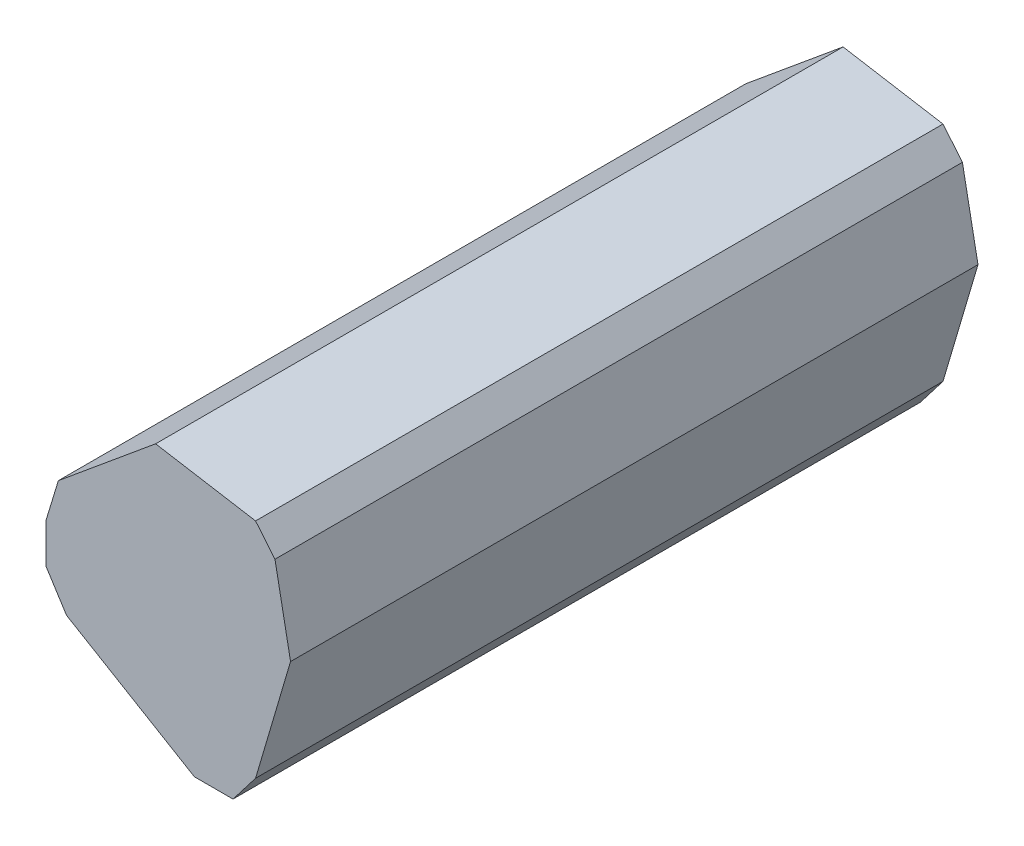
ISO-10303-21;
HEADER;
FILE_DESCRIPTION(('STEP AP214'),'2;1');
FILE_NAME('part.step','',(''),(''),'','','');
FILE_SCHEMA(('AUTOMOTIVE_DESIGN { 1 0 10303 214 1 1 1 1 }'));
ENDSEC;
DATA;
#1=APPLICATION_CONTEXT('core data for automotive mechanical design processes');
#2=APPLICATION_PROTOCOL_DEFINITION('international standard','automotive_design',2000,#1);
#3=PRODUCT_CONTEXT('',#1,'mechanical');
#4=PRODUCT('Part','Part','',(#3));
#5=PRODUCT_RELATED_PRODUCT_CATEGORY('part','',(#4));
#6=PRODUCT_DEFINITION_FORMATION('','',#4);
#7=PRODUCT_DEFINITION_CONTEXT('part definition',#1,'design');
#8=PRODUCT_DEFINITION('design','',#6,#7);
#9=PRODUCT_DEFINITION_SHAPE('','',#8);
#10=(LENGTH_UNIT() NAMED_UNIT(*) SI_UNIT(.MILLI.,.METRE.));
#11=(NAMED_UNIT(*) PLANE_ANGLE_UNIT() SI_UNIT($,.RADIAN.));
#12=(NAMED_UNIT(*) SI_UNIT($,.STERADIAN.) SOLID_ANGLE_UNIT());
#13=UNCERTAINTY_MEASURE_WITH_UNIT(LENGTH_MEASURE(1.E-05),#10,'distance_accuracy_value','');
#14=(GEOMETRIC_REPRESENTATION_CONTEXT(3) GLOBAL_UNCERTAINTY_ASSIGNED_CONTEXT((#13)) GLOBAL_UNIT_ASSIGNED_CONTEXT((#10,
#11,#12)) REPRESENTATION_CONTEXT('',''));
#15=CARTESIAN_POINT('',(0.,0.,0.));
#16=DIRECTION('',(0.,0.,1.));
#17=DIRECTION('',(1.,0.,0.));
#18=AXIS2_PLACEMENT_3D('',#15,#16,#17);
#19=CARTESIAN_POINT('',(-0.539610728637285,-8.59455076937365,30.));
#20=DIRECTION('',(0.956610637021111,-0.291369334587676,0.));
#21=DIRECTION('',(0.291369334587676,0.956610637021111,0.));
#22=AXIS2_PLACEMENT_3D('',#19,#20,#21);
#23=PLANE('',#22);
#24=DIRECTION('',(-0.291369334587676,-0.956610637021111,0.));
#25=VECTOR('',#24,1.);
#26=CARTESIAN_POINT('',(-0.539610728637285,-8.59455076937365,0.));
#27=LINE('',#26,#25);
#28=CARTESIAN_POINT('',(0.,-6.82292520144756,0.));
#29=VERTEX_POINT('',#28);
#30=CARTESIAN_POINT('',(-0.539610728637285,-8.59455076937365,0.));
#31=VERTEX_POINT('',#30);
#32=EDGE_CURVE('E149',#29,#31,#27,.T.);
#33=ORIENTED_EDGE('',*,*,#32,.T.);
#34=DIRECTION('',(0.,0.,-1.));
#35=VECTOR('',#34,1.);
#36=CARTESIAN_POINT('',(-0.539610728637285,-8.59455076937365,30.));
#37=LINE('',#36,#35);
#38=CARTESIAN_POINT('',(-0.539610728637285,-8.59455076937365,30.));
#39=VERTEX_POINT('',#38);
#40=EDGE_CURVE('E11',#39,#31,#37,.T.);
#41=ORIENTED_EDGE('',*,*,#40,.F.);
#42=DIRECTION('',(-0.291369334587676,-0.956610637021111,0.));
#43=VECTOR('',#42,1.);
#44=CARTESIAN_POINT('',(-0.539610728637285,-8.59455076937365,30.));
#45=LINE('',#44,#43);
#46=CARTESIAN_POINT('',(0.,-6.82292520144756,30.));
#47=VERTEX_POINT('',#46);
#48=EDGE_CURVE('E169',#47,#39,#45,.T.);
#49=ORIENTED_EDGE('',*,*,#48,.F.);
#50=DIRECTION('',(0.,0.,-1.));
#51=VECTOR('',#50,1.);
#52=CARTESIAN_POINT('',(0.,-6.82292520144756,30.));
#53=LINE('',#52,#51);
#54=EDGE_CURVE('E145',#47,#29,#53,.T.);
#55=ORIENTED_EDGE('',*,*,#54,.T.);
#56=EDGE_LOOP('',(#33,#41,#49,#55));
#57=FACE_BOUND('',#56,.T.);
#58=ADVANCED_FACE('F35',(#57),#23,.F.);
#59=CARTESIAN_POINT('',(-0.539610728637285,-10.3300637876913,30.));
#60=DIRECTION('',(1.,0.,0.));
#61=DIRECTION('',(0.,0.,-1.));
#62=AXIS2_PLACEMENT_3D('',#59,#60,#61);
#63=PLANE('',#62);
#64=DIRECTION('',(0.,-1.,0.));
#65=VECTOR('',#64,1.);
#66=CARTESIAN_POINT('',(-0.539610728637285,-10.3300637876913,0.));
#67=LINE('',#66,#65);
#68=CARTESIAN_POINT('',(-0.539610728637285,-10.3300637876913,0.));
#69=VERTEX_POINT('',#68);
#70=EDGE_CURVE('E152',#31,#69,#67,.T.);
#71=ORIENTED_EDGE('',*,*,#70,.T.);
#72=DIRECTION('',(0.,0.,-1.));
#73=VECTOR('',#72,1.);
#74=CARTESIAN_POINT('',(-0.539610728637285,-10.3300637876913,30.));
#75=LINE('',#74,#73);
#76=CARTESIAN_POINT('',(-0.539610728637285,-10.3300637876913,30.));
#77=VERTEX_POINT('',#76);
#78=EDGE_CURVE('E43',#77,#69,#75,.T.);
#79=ORIENTED_EDGE('',*,*,#78,.F.);
#80=DIRECTION('',(0.,-1.,0.));
#81=VECTOR('',#80,1.);
#82=CARTESIAN_POINT('',(-0.539610728637285,-10.3300637876913,30.));
#83=LINE('',#82,#81);
#84=EDGE_CURVE('E103',#39,#77,#83,.T.);
#85=ORIENTED_EDGE('',*,*,#84,.F.);
#86=ORIENTED_EDGE('',*,*,#40,.T.);
#87=EDGE_LOOP('',(#71,#79,#85,#86));
#88=FACE_BOUND('',#87,.T.);
#89=ADVANCED_FACE('F241',(#88),#63,.F.);
#90=CARTESIAN_POINT('',(0.35570281020208,-11.7351455443057,30.));
#91=DIRECTION('',(0.843343100026109,0.537375488497897,0.));
#92=DIRECTION('',(-0.537375488497897,0.843343100026109,0.));
#93=AXIS2_PLACEMENT_3D('',#90,#91,#92);
#94=PLANE('',#93);
#95=DIRECTION('',(0.537375488497897,-0.843343100026109,0.));
#96=VECTOR('',#95,1.);
#97=CARTESIAN_POINT('',(0.35570281020208,-11.7351455443057,0.));
#98=LINE('',#97,#96);
#99=CARTESIAN_POINT('',(0.35570281020208,-11.7351455443057,0.));
#100=VERTEX_POINT('',#99);
#101=EDGE_CURVE('E154',#69,#100,#98,.T.);
#102=ORIENTED_EDGE('',*,*,#101,.T.);
#103=DIRECTION('',(0.,0.,-1.));
#104=VECTOR('',#103,1.);
#105=CARTESIAN_POINT('',(0.35570281020208,-11.7351455443057,30.));
#106=LINE('',#105,#104);
#107=CARTESIAN_POINT('',(0.35570281020208,-11.7351455443057,30.));
#108=VERTEX_POINT('',#107);
#109=EDGE_CURVE('E185',#108,#100,#106,.T.);
#110=ORIENTED_EDGE('',*,*,#109,.F.);
#111=DIRECTION('',(0.537375488497897,-0.843343100026109,0.));
#112=VECTOR('',#111,1.);
#113=CARTESIAN_POINT('',(0.35570281020208,-11.7351455443057,30.));
#114=LINE('',#113,#112);
#115=EDGE_CURVE('E193',#77,#108,#114,.T.);
#116=ORIENTED_EDGE('',*,*,#115,.F.);
#117=ORIENTED_EDGE('',*,*,#78,.T.);
#118=EDGE_LOOP('',(#102,#110,#116,#117));
#119=FACE_BOUND('',#118,.T.);
#120=ADVANCED_FACE('F191',(#119),#94,.F.);
#121=CARTESIAN_POINT('',(5.93702203997669,-15.0473772654607,30.));
#122=DIRECTION('',(0.51034774842483,0.859968124803302,0.));
#123=DIRECTION('',(-0.859968124803302,0.51034774842483,0.));
#124=AXIS2_PLACEMENT_3D('',#121,#122,#123);
#125=PLANE('',#124);
#126=DIRECTION('',(0.859968124803301,-0.51034774842483,0.));
#127=VECTOR('',#126,1.);
#128=CARTESIAN_POINT('',(5.93702203997669,-15.0473772654607,0.));
#129=LINE('',#128,#127);
#130=CARTESIAN_POINT('',(5.93702203997669,-15.0473772654607,0.));
#131=VERTEX_POINT('',#130);
#132=EDGE_CURVE('E156',#100,#131,#129,.T.);
#133=ORIENTED_EDGE('',*,*,#132,.T.);
#134=DIRECTION('',(0.,0.,-1.));
#135=VECTOR('',#134,1.);
#136=CARTESIAN_POINT('',(5.93702203997669,-15.0473772654607,30.));
#137=LINE('',#136,#135);
#138=CARTESIAN_POINT('',(5.93702203997669,-15.0473772654607,30.));
#139=VERTEX_POINT('',#138);
#140=EDGE_CURVE('E182',#139,#131,#137,.T.);
#141=ORIENTED_EDGE('',*,*,#140,.F.);
#142=DIRECTION('',(0.859968124803301,-0.51034774842483,0.));
#143=VECTOR('',#142,1.);
#144=CARTESIAN_POINT('',(5.93702203997669,-15.0473772654607,30.));
#145=LINE('',#144,#143);
#146=EDGE_CURVE('E211',#108,#139,#145,.T.);
#147=ORIENTED_EDGE('',*,*,#146,.F.);
#148=ORIENTED_EDGE('',*,*,#109,.T.);
#149=EDGE_LOOP('',(#133,#141,#147,#148));
#150=FACE_BOUND('',#149,.T.);
#151=ADVANCED_FACE('F202',(#150),#125,.F.);
#152=CARTESIAN_POINT('',(7.62232399404184,-15.0473772654607,30.));
#153=DIRECTION('',(0.,1.,0.));
#154=DIRECTION('',(0.,0.,1.));
#155=AXIS2_PLACEMENT_3D('',#152,#153,#154);
#156=PLANE('',#155);
#157=DIRECTION('',(1.,0.,0.));
#158=VECTOR('',#157,1.);
#159=CARTESIAN_POINT('',(7.62232399404184,-15.0473772654607,0.));
#160=LINE('',#159,#158);
#161=CARTESIAN_POINT('',(7.62232399404184,-15.0473772654607,0.));
#162=VERTEX_POINT('',#161);
#163=EDGE_CURVE('E158',#131,#162,#160,.T.);
#164=ORIENTED_EDGE('',*,*,#163,.T.);
#165=DIRECTION('',(0.,0.,-1.));
#166=VECTOR('',#165,1.);
#167=CARTESIAN_POINT('',(7.62232399404184,-15.0473772654607,30.));
#168=LINE('',#167,#166);
#169=CARTESIAN_POINT('',(7.62232399404184,-15.0473772654607,30.));
#170=VERTEX_POINT('',#169);
#171=EDGE_CURVE('E179',#170,#162,#168,.T.);
#172=ORIENTED_EDGE('',*,*,#171,.F.);
#173=DIRECTION('',(1.,0.,0.));
#174=VECTOR('',#173,1.);
#175=CARTESIAN_POINT('',(7.62232399404184,-15.0473772654607,30.));
#176=LINE('',#175,#174);
#177=EDGE_CURVE('E208',#139,#170,#176,.T.);
#178=ORIENTED_EDGE('',*,*,#177,.F.);
#179=ORIENTED_EDGE('',*,*,#140,.T.);
#180=EDGE_LOOP('',(#164,#172,#178,#179));
#181=FACE_BOUND('',#180,.T.);
#182=ADVANCED_FACE('F206',(#181),#156,.F.);
#183=CARTESIAN_POINT('',(8.60567491807274,-13.7684778708262,30.));
#184=DIRECTION('',(-0.792749142789878,0.609548026496611,0.));
#185=DIRECTION('',(-0.609548026496611,-0.792749142789878,0.));
#186=AXIS2_PLACEMENT_3D('',#183,#184,#185);
#187=PLANE('',#186);
#188=DIRECTION('',(0.609548026496611,0.792749142789878,0.));
#189=VECTOR('',#188,1.);
#190=CARTESIAN_POINT('',(8.60567491807274,-13.7684778708262,0.));
#191=LINE('',#190,#189);
#192=CARTESIAN_POINT('',(8.60567491807274,-13.7684778708262,0.));
#193=VERTEX_POINT('',#192);
#194=EDGE_CURVE('E160',#162,#193,#191,.T.);
#195=ORIENTED_EDGE('',*,*,#194,.T.);
#196=DIRECTION('',(0.,0.,-1.));
#197=VECTOR('',#196,1.);
#198=CARTESIAN_POINT('',(8.60567491807274,-13.7684778708262,30.));
#199=LINE('',#198,#197);
#200=CARTESIAN_POINT('',(8.60567491807274,-13.7684778708262,30.));
#201=VERTEX_POINT('',#200);
#202=EDGE_CURVE('E176',#201,#193,#199,.T.);
#203=ORIENTED_EDGE('',*,*,#202,.F.);
#204=DIRECTION('',(0.609548026496611,0.792749142789878,0.));
#205=VECTOR('',#204,1.);
#206=CARTESIAN_POINT('',(8.60567491807274,-13.7684778708262,30.));
#207=LINE('',#206,#205);
#208=EDGE_CURVE('E210',#170,#201,#207,.T.);
#209=ORIENTED_EDGE('',*,*,#208,.F.);
#210=ORIENTED_EDGE('',*,*,#171,.T.);
#211=EDGE_LOOP('',(#195,#203,#209,#210));
#212=FACE_BOUND('',#211,.T.);
#213=ADVANCED_FACE('F254',(#212),#187,.F.);
#214=CARTESIAN_POINT('',(10.1324418797404,-8.59455076937365,30.));
#215=DIRECTION('',(-0.959113024890238,0.283023330285504,0.));
#216=DIRECTION('',(-0.283023330285504,-0.959113024890238,0.));
#217=AXIS2_PLACEMENT_3D('',#214,#215,#216);
#218=PLANE('',#217);
#219=DIRECTION('',(0.283023330285504,0.959113024890238,0.));
#220=VECTOR('',#219,1.);
#221=CARTESIAN_POINT('',(10.1324418797404,-8.59455076937365,0.));
#222=LINE('',#221,#220);
#223=CARTESIAN_POINT('',(10.1324418797404,-8.59455076937365,0.));
#224=VERTEX_POINT('',#223);
#225=EDGE_CURVE('E162',#193,#224,#222,.T.);
#226=ORIENTED_EDGE('',*,*,#225,.T.);
#227=DIRECTION('',(0.,0.,-1.));
#228=VECTOR('',#227,1.);
#229=CARTESIAN_POINT('',(10.1324418797404,-8.59455076937365,30.));
#230=LINE('',#229,#228);
#231=CARTESIAN_POINT('',(10.1324418797404,-8.59455076937365,30.));
#232=VERTEX_POINT('',#231);
#233=EDGE_CURVE('E173',#232,#224,#230,.T.);
#234=ORIENTED_EDGE('',*,*,#233,.F.);
#235=DIRECTION('',(0.283023330285504,0.959113024890238,0.));
#236=VECTOR('',#235,1.);
#237=CARTESIAN_POINT('',(10.1324418797404,-8.59455076937365,30.));
#238=LINE('',#237,#236);
#239=EDGE_CURVE('E213',#201,#232,#238,.T.);
#240=ORIENTED_EDGE('',*,*,#239,.F.);
#241=ORIENTED_EDGE('',*,*,#202,.T.);
#242=EDGE_LOOP('',(#226,#234,#240,#241));
#243=FACE_BOUND('',#242,.T.);
#244=ADVANCED_FACE('F222',(#243),#218,.F.);
#245=CARTESIAN_POINT('',(9.45304442687734,-5.06611166058235,30.));
#246=DIRECTION('',(-0.981962475627224,-0.189075901320219,0.));
#247=DIRECTION('',(0.189075901320219,-0.981962475627224,0.));
#248=AXIS2_PLACEMENT_3D('',#245,#246,#247);
#249=PLANE('',#248);
#250=DIRECTION('',(-0.189075901320219,0.981962475627224,0.));
#251=VECTOR('',#250,1.);
#252=CARTESIAN_POINT('',(9.45304442687734,-5.06611166058235,0.));
#253=LINE('',#252,#251);
#254=CARTESIAN_POINT('',(9.45304442687734,-5.06611166058235,0.));
#255=VERTEX_POINT('',#254);
#256=EDGE_CURVE('E164',#224,#255,#253,.T.);
#257=ORIENTED_EDGE('',*,*,#256,.T.);
#258=DIRECTION('',(0.,0.,-1.));
#259=VECTOR('',#258,1.);
#260=CARTESIAN_POINT('',(9.45304442687734,-5.06611166058235,30.));
#261=LINE('',#260,#259);
#262=CARTESIAN_POINT('',(9.45304442687734,-5.06611166058235,30.));
#263=VERTEX_POINT('',#262);
#264=EDGE_CURVE('E140',#263,#255,#261,.T.);
#265=ORIENTED_EDGE('',*,*,#264,.F.);
#266=DIRECTION('',(-0.189075901320219,0.981962475627224,0.));
#267=VECTOR('',#266,1.);
#268=CARTESIAN_POINT('',(9.45304442687734,-5.06611166058235,30.));
#269=LINE('',#268,#267);
#270=EDGE_CURVE('E131',#232,#263,#269,.T.);
#271=ORIENTED_EDGE('',*,*,#270,.F.);
#272=ORIENTED_EDGE('',*,*,#233,.T.);
#273=EDGE_LOOP('',(#257,#265,#271,#272));
#274=FACE_BOUND('',#273,.T.);
#275=ADVANCED_FACE('F226',(#274),#249,.F.);
#276=CARTESIAN_POINT('',(8.60567491807274,-4.04257785515938,30.));
#277=DIRECTION('',(-0.770280809360129,-0.637704849230038,0.));
#278=DIRECTION('',(0.637704849230038,-0.770280809360129,0.));
#279=AXIS2_PLACEMENT_3D('',#276,#277,#278);
#280=PLANE('',#279);
#281=DIRECTION('',(-0.637704849230038,0.770280809360128,0.));
#282=VECTOR('',#281,1.);
#283=CARTESIAN_POINT('',(8.60567491807274,-4.04257785515938,0.));
#284=LINE('',#283,#282);
#285=CARTESIAN_POINT('',(8.60567491807274,-4.04257785515938,0.));
#286=VERTEX_POINT('',#285);
#287=EDGE_CURVE('E139',#255,#286,#284,.T.);
#288=ORIENTED_EDGE('',*,*,#287,.T.);
#289=DIRECTION('',(0.,0.,-1.));
#290=VECTOR('',#289,1.);
#291=CARTESIAN_POINT('',(8.60567491807274,-4.04257785515938,30.));
#292=LINE('',#291,#290);
#293=CARTESIAN_POINT('',(8.60567491807274,-4.04257785515938,30.));
#294=VERTEX_POINT('',#293);
#295=EDGE_CURVE('E136',#294,#286,#292,.T.);
#296=ORIENTED_EDGE('',*,*,#295,.F.);
#297=DIRECTION('',(-0.637704849230038,0.770280809360128,0.));
#298=VECTOR('',#297,1.);
#299=CARTESIAN_POINT('',(8.60567491807274,-4.04257785515938,30.));
#300=LINE('',#299,#298);
#301=EDGE_CURVE('E125',#263,#294,#300,.T.);
#302=ORIENTED_EDGE('',*,*,#301,.F.);
#303=ORIENTED_EDGE('',*,*,#264,.T.);
#304=EDGE_LOOP('',(#288,#296,#302,#303));
#305=FACE_BOUND('',#304,.T.);
#306=ADVANCED_FACE('F137',(#305),#280,.F.);
#307=CARTESIAN_POINT('',(4.24409429467687,-3.30929811971714,30.));
#308=DIRECTION('',(-0.165795682310953,-0.986160124790617,0.));
#309=DIRECTION('',(0.986160124790617,-0.165795682310953,0.));
#310=AXIS2_PLACEMENT_3D('',#307,#308,#309);
#311=PLANE('',#310);
#312=DIRECTION('',(-0.986160124790617,0.165795682310953,0.));
#313=VECTOR('',#312,1.);
#314=CARTESIAN_POINT('',(4.24409429467687,-3.30929811971714,0.));
#315=LINE('',#314,#313);
#316=CARTESIAN_POINT('',(4.24409429467687,-3.30929811971714,0.));
#317=VERTEX_POINT('',#316);
#318=EDGE_CURVE('E89',#286,#317,#315,.T.);
#319=ORIENTED_EDGE('',*,*,#318,.T.);
#320=DIRECTION('',(0.,0.,-1.));
#321=VECTOR('',#320,1.);
#322=CARTESIAN_POINT('',(4.24409429467687,-3.30929811971714,30.));
#323=LINE('',#322,#321);
#324=CARTESIAN_POINT('',(4.24409429467687,-3.30929811971714,30.));
#325=VERTEX_POINT('',#324);
#326=EDGE_CURVE('E141',#325,#317,#323,.T.);
#327=ORIENTED_EDGE('',*,*,#326,.F.);
#328=DIRECTION('',(-0.986160124790617,0.165795682310953,0.));
#329=VECTOR('',#328,1.);
#330=CARTESIAN_POINT('',(4.24409429467687,-3.30929811971714,30.));
#331=LINE('',#330,#329);
#332=EDGE_CURVE('E129',#294,#325,#331,.T.);
#333=ORIENTED_EDGE('',*,*,#332,.F.);
#334=ORIENTED_EDGE('',*,*,#295,.T.);
#335=EDGE_LOOP('',(#319,#327,#333,#334));
#336=FACE_BOUND('',#335,.T.);
#337=ADVANCED_FACE('F143',(#336),#311,.F.);
#338=CARTESIAN_POINT('',(0.,-6.82292520144756,30.));
#339=DIRECTION('',(0.637704849230037,-0.770280809360129,0.));
#340=DIRECTION('',(0.770280809360129,0.637704849230037,0.));
#341=AXIS2_PLACEMENT_3D('',#338,#339,#340);
#342=PLANE('',#341);
#343=DIRECTION('',(-0.770280809360129,-0.637704849230037,0.));
#344=VECTOR('',#343,1.);
#345=CARTESIAN_POINT('',(0.,-6.82292520144756,0.));
#346=LINE('',#345,#344);
#347=EDGE_CURVE('E95',#317,#29,#346,.T.);
#348=ORIENTED_EDGE('',*,*,#347,.T.);
#349=ORIENTED_EDGE('',*,*,#54,.F.);
#350=DIRECTION('',(-0.770280809360129,-0.637704849230037,0.));
#351=VECTOR('',#350,1.);
#352=CARTESIAN_POINT('',(0.,-6.82292520144756,30.));
#353=LINE('',#352,#351);
#354=EDGE_CURVE('E51',#325,#47,#353,.T.);
#355=ORIENTED_EDGE('',*,*,#354,.F.);
#356=ORIENTED_EDGE('',*,*,#326,.T.);
#357=EDGE_LOOP('',(#348,#349,#355,#356));
#358=FACE_BOUND('',#357,.T.);
#359=ADVANCED_FACE('F230',(#358),#342,.F.);
#360=CARTESIAN_POINT('',(0.,0.,30.));
#361=DIRECTION('',(0.,0.,-1.));
#362=DIRECTION('',(-1.,0.,0.));
#363=AXIS2_PLACEMENT_3D('',#360,#361,#362);
#364=PLANE('',#363);
#365=ORIENTED_EDGE('',*,*,#48,.T.);
#366=ORIENTED_EDGE('',*,*,#84,.T.);
#367=ORIENTED_EDGE('',*,*,#115,.T.);
#368=ORIENTED_EDGE('',*,*,#146,.T.);
#369=ORIENTED_EDGE('',*,*,#177,.T.);
#370=ORIENTED_EDGE('',*,*,#208,.T.);
#371=ORIENTED_EDGE('',*,*,#239,.T.);
#372=ORIENTED_EDGE('',*,*,#270,.T.);
#373=ORIENTED_EDGE('',*,*,#301,.T.);
#374=ORIENTED_EDGE('',*,*,#332,.T.);
#375=ORIENTED_EDGE('',*,*,#354,.T.);
#376=EDGE_LOOP('',(#365,#366,#367,#368,#369,#370,#371,#372,#373,#374,#375));
#377=FACE_BOUND('',#376,.T.);
#378=ADVANCED_FACE('F127',(#377),#364,.F.);
#379=CARTESIAN_POINT('',(0.,0.,0.));
#380=DIRECTION('',(0.,0.,-1.));
#381=DIRECTION('',(-1.,0.,0.));
#382=AXIS2_PLACEMENT_3D('',#379,#380,#381);
#383=PLANE('',#382);
#384=ORIENTED_EDGE('',*,*,#32,.F.);
#385=ORIENTED_EDGE('',*,*,#347,.F.);
#386=ORIENTED_EDGE('',*,*,#318,.F.);
#387=ORIENTED_EDGE('',*,*,#287,.F.);
#388=ORIENTED_EDGE('',*,*,#256,.F.);
#389=ORIENTED_EDGE('',*,*,#225,.F.);
#390=ORIENTED_EDGE('',*,*,#194,.F.);
#391=ORIENTED_EDGE('',*,*,#163,.F.);
#392=ORIENTED_EDGE('',*,*,#132,.F.);
#393=ORIENTED_EDGE('',*,*,#101,.F.);
#394=ORIENTED_EDGE('',*,*,#70,.F.);
#395=EDGE_LOOP('',(#384,#385,#386,#387,#388,#389,#390,#391,#392,#393,#394));
#396=FACE_BOUND('',#395,.T.);
#397=ADVANCED_FACE('F197',(#396),#383,.T.);
#398=CLOSED_SHELL('',(#58,#89,#120,#151,#182,#213,#244,#275,#306,#337,#359,#378,#397));
#399=MANIFOLD_SOLID_BREP('B2',#398);
#400=ADVANCED_BREP_SHAPE_REPRESENTATION('',(#18,#399),#14);
#401=SHAPE_DEFINITION_REPRESENTATION(#9,#400);
ENDSEC;
END-ISO-10303-21;
